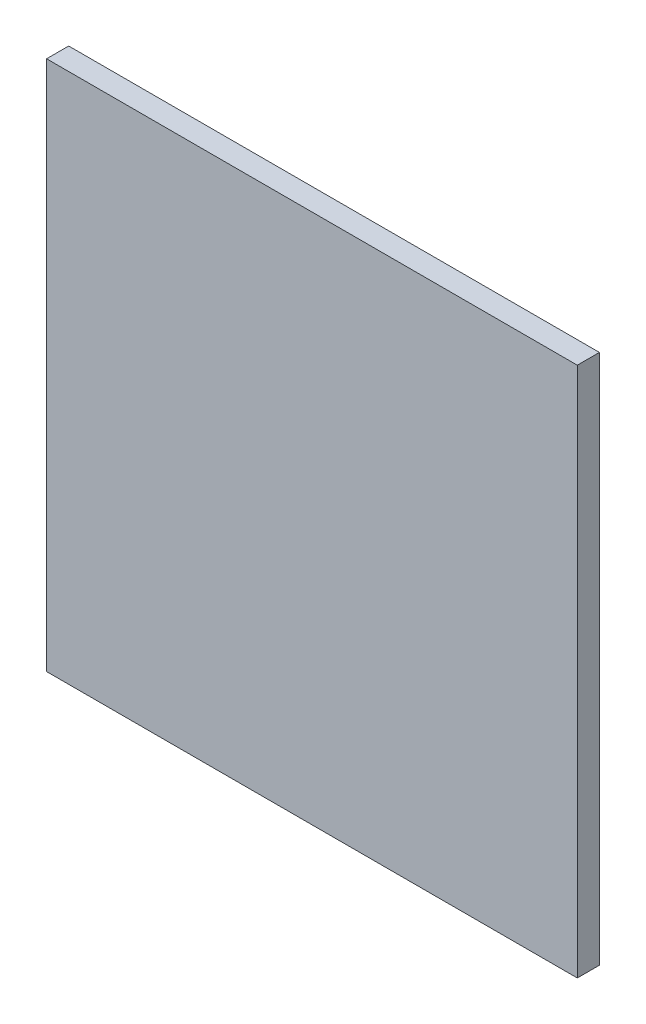
ISO-10303-21;
HEADER;
FILE_DESCRIPTION(('STEP AP214'),'2;1');
FILE_NAME('part.step','',(''),(''),'','','');
FILE_SCHEMA(('AUTOMOTIVE_DESIGN { 1 0 10303 214 1 1 1 1 }'));
ENDSEC;
DATA;
#1=APPLICATION_CONTEXT('core data for automotive mechanical design processes');
#2=APPLICATION_PROTOCOL_DEFINITION('international standard','automotive_design',2000,#1);
#3=PRODUCT_CONTEXT('',#1,'mechanical');
#4=PRODUCT('Part','Part','',(#3));
#5=PRODUCT_RELATED_PRODUCT_CATEGORY('part','',(#4));
#6=PRODUCT_DEFINITION_FORMATION('','',#4);
#7=PRODUCT_DEFINITION_CONTEXT('part definition',#1,'design');
#8=PRODUCT_DEFINITION('design','',#6,#7);
#9=PRODUCT_DEFINITION_SHAPE('','',#8);
#10=(LENGTH_UNIT() NAMED_UNIT(*) SI_UNIT(.MILLI.,.METRE.));
#11=(NAMED_UNIT(*) PLANE_ANGLE_UNIT() SI_UNIT($,.RADIAN.));
#12=(NAMED_UNIT(*) SI_UNIT($,.STERADIAN.) SOLID_ANGLE_UNIT());
#13=UNCERTAINTY_MEASURE_WITH_UNIT(LENGTH_MEASURE(1.E-05),#10,'distance_accuracy_value','');
#14=(GEOMETRIC_REPRESENTATION_CONTEXT(3) GLOBAL_UNCERTAINTY_ASSIGNED_CONTEXT((#13)) GLOBAL_UNIT_ASSIGNED_CONTEXT((#10,
#11,#12)) REPRESENTATION_CONTEXT('',''));
#15=CARTESIAN_POINT('',(0.,0.,0.));
#16=DIRECTION('',(0.,0.,1.));
#17=DIRECTION('',(1.,0.,0.));
#18=AXIS2_PLACEMENT_3D('',#15,#16,#17);
#19=CARTESIAN_POINT('',(60.,60.,5.));
#20=DIRECTION('',(-1.,0.,0.));
#21=DIRECTION('',(0.,-1.,0.));
#22=AXIS2_PLACEMENT_3D('',#19,#20,#21);
#23=PLANE('',#22);
#24=DIRECTION('',(0.,1.,0.));
#25=VECTOR('',#24,1.);
#26=CARTESIAN_POINT('',(60.,60.,0.));
#27=LINE('',#26,#25);
#28=CARTESIAN_POINT('',(60.,-60.,0.));
#29=VERTEX_POINT('',#28);
#30=CARTESIAN_POINT('',(60.,60.,0.));
#31=VERTEX_POINT('',#30);
#32=EDGE_CURVE('E147',#29,#31,#27,.T.);
#33=ORIENTED_EDGE('',*,*,#32,.T.);
#34=DIRECTION('',(0.,0.,-1.));
#35=VECTOR('',#34,1.);
#36=CARTESIAN_POINT('',(60.,60.,5.));
#37=LINE('',#36,#35);
#38=CARTESIAN_POINT('',(60.,60.,5.));
#39=VERTEX_POINT('',#38);
#40=EDGE_CURVE('E11',#39,#31,#37,.T.);
#41=ORIENTED_EDGE('',*,*,#40,.F.);
#42=DIRECTION('',(0.,1.,0.));
#43=VECTOR('',#42,1.);
#44=CARTESIAN_POINT('',(60.,60.,5.));
#45=LINE('',#44,#43);
#46=CARTESIAN_POINT('',(60.,-60.,5.));
#47=VERTEX_POINT('',#46);
#48=EDGE_CURVE('E151',#47,#39,#45,.T.);
#49=ORIENTED_EDGE('',*,*,#48,.F.);
#50=DIRECTION('',(0.,0.,-1.));
#51=VECTOR('',#50,1.);
#52=CARTESIAN_POINT('',(60.,-60.,5.));
#53=LINE('',#52,#51);
#54=EDGE_CURVE('E157',#47,#29,#53,.T.);
#55=ORIENTED_EDGE('',*,*,#54,.T.);
#56=EDGE_LOOP('',(#33,#41,#49,#55));
#57=FACE_BOUND('',#56,.T.);
#58=ADVANCED_FACE('F39',(#57),#23,.F.);
#59=CARTESIAN_POINT('',(-60.,60.,5.));
#60=DIRECTION('',(0.,-1.,0.));
#61=DIRECTION('',(0.,0.,-1.));
#62=AXIS2_PLACEMENT_3D('',#59,#60,#61);
#63=PLANE('',#62);
#64=DIRECTION('',(-1.,0.,0.));
#65=VECTOR('',#64,1.);
#66=CARTESIAN_POINT('',(-60.,60.,0.));
#67=LINE('',#66,#65);
#68=CARTESIAN_POINT('',(-60.,60.,0.));
#69=VERTEX_POINT('',#68);
#70=EDGE_CURVE('E160',#31,#69,#67,.T.);
#71=ORIENTED_EDGE('',*,*,#70,.T.);
#72=DIRECTION('',(0.,0.,-1.));
#73=VECTOR('',#72,1.);
#74=CARTESIAN_POINT('',(-60.,60.,5.));
#75=LINE('',#74,#73);
#76=CARTESIAN_POINT('',(-60.,60.,5.));
#77=VERTEX_POINT('',#76);
#78=EDGE_CURVE('E46',#77,#69,#75,.T.);
#79=ORIENTED_EDGE('',*,*,#78,.F.);
#80=DIRECTION('',(-1.,0.,0.));
#81=VECTOR('',#80,1.);
#82=CARTESIAN_POINT('',(-60.,60.,5.));
#83=LINE('',#82,#81);
#84=EDGE_CURVE('E90',#39,#77,#83,.T.);
#85=ORIENTED_EDGE('',*,*,#84,.F.);
#86=ORIENTED_EDGE('',*,*,#40,.T.);
#87=EDGE_LOOP('',(#71,#79,#85,#86));
#88=FACE_BOUND('',#87,.T.);
#89=ADVANCED_FACE('F188',(#88),#63,.F.);
#90=CARTESIAN_POINT('',(-60.,60.,5.));
#91=DIRECTION('',(1.,0.,0.));
#92=DIRECTION('',(0.,0.,-1.));
#93=AXIS2_PLACEMENT_3D('',#90,#91,#92);
#94=PLANE('',#93);
#95=DIRECTION('',(0.,-1.,0.));
#96=VECTOR('',#95,1.);
#97=CARTESIAN_POINT('',(-60.,60.,0.));
#98=LINE('',#97,#96);
#99=CARTESIAN_POINT('',(-60.,-60.,0.));
#100=VERTEX_POINT('',#99);
#101=EDGE_CURVE('E162',#69,#100,#98,.T.);
#102=ORIENTED_EDGE('',*,*,#101,.T.);
#103=DIRECTION('',(0.,0.,-1.));
#104=VECTOR('',#103,1.);
#105=CARTESIAN_POINT('',(-60.,-60.,5.));
#106=LINE('',#105,#104);
#107=CARTESIAN_POINT('',(-60.,-60.,5.));
#108=VERTEX_POINT('',#107);
#109=EDGE_CURVE('E166',#108,#100,#106,.T.);
#110=ORIENTED_EDGE('',*,*,#109,.F.);
#111=DIRECTION('',(0.,-1.,0.));
#112=VECTOR('',#111,1.);
#113=CARTESIAN_POINT('',(-60.,60.,5.));
#114=LINE('',#113,#112);
#115=EDGE_CURVE('E154',#77,#108,#114,.T.);
#116=ORIENTED_EDGE('',*,*,#115,.F.);
#117=ORIENTED_EDGE('',*,*,#78,.T.);
#118=EDGE_LOOP('',(#102,#110,#116,#117));
#119=FACE_BOUND('',#118,.T.);
#120=ADVANCED_FACE('F171',(#119),#94,.F.);
#121=CARTESIAN_POINT('',(-60.,-60.,5.));
#122=DIRECTION('',(0.,1.,0.));
#123=DIRECTION('',(0.,0.,1.));
#124=AXIS2_PLACEMENT_3D('',#121,#122,#123);
#125=PLANE('',#124);
#126=DIRECTION('',(1.,0.,0.));
#127=VECTOR('',#126,1.);
#128=CARTESIAN_POINT('',(-60.,-60.,0.));
#129=LINE('',#128,#127);
#130=EDGE_CURVE('E83',#100,#29,#129,.T.);
#131=ORIENTED_EDGE('',*,*,#130,.T.);
#132=ORIENTED_EDGE('',*,*,#54,.F.);
#133=DIRECTION('',(1.,0.,0.));
#134=VECTOR('',#133,1.);
#135=CARTESIAN_POINT('',(-60.,-60.,5.));
#136=LINE('',#135,#134);
#137=EDGE_CURVE('E62',#108,#47,#136,.T.);
#138=ORIENTED_EDGE('',*,*,#137,.F.);
#139=ORIENTED_EDGE('',*,*,#109,.T.);
#140=EDGE_LOOP('',(#131,#132,#138,#139));
#141=FACE_BOUND('',#140,.T.);
#142=ADVANCED_FACE('F179',(#141),#125,.F.);
#143=CARTESIAN_POINT('',(0.,0.,5.));
#144=DIRECTION('',(0.,0.,1.));
#145=DIRECTION('',(1.,0.,0.));
#146=AXIS2_PLACEMENT_3D('',#143,#144,#145);
#147=PLANE('',#146);
#148=ORIENTED_EDGE('',*,*,#48,.T.);
#149=ORIENTED_EDGE('',*,*,#84,.T.);
#150=ORIENTED_EDGE('',*,*,#115,.T.);
#151=ORIENTED_EDGE('',*,*,#137,.T.);
#152=EDGE_LOOP('',(#148,#149,#150,#151));
#153=FACE_BOUND('',#152,.T.);
#154=ADVANCED_FACE('F181',(#153),#147,.T.);
#155=CARTESIAN_POINT('',(0.,0.,0.));
#156=DIRECTION('',(0.,0.,1.));
#157=DIRECTION('',(1.,0.,0.));
#158=AXIS2_PLACEMENT_3D('',#155,#156,#157);
#159=PLANE('',#158);
#160=DIRECTION('',(1.,0.,0.));
#161=VECTOR('',#160,1.);
#162=CARTESIAN_POINT('',(50.,50.,0.));
#163=LINE('',#162,#161);
#164=CARTESIAN_POINT('',(-50.,50.,0.));
#165=VERTEX_POINT('',#164);
#166=CARTESIAN_POINT('',(50.,50.,0.));
#167=VERTEX_POINT('',#166);
#168=EDGE_CURVE('E141',#165,#167,#163,.T.);
#169=ORIENTED_EDGE('',*,*,#168,.F.);
#170=DIRECTION('',(0.,1.,0.));
#171=VECTOR('',#170,1.);
#172=CARTESIAN_POINT('',(-50.,50.,0.));
#173=LINE('',#172,#171);
#174=CARTESIAN_POINT('',(-50.,-50.,0.));
#175=VERTEX_POINT('',#174);
#176=EDGE_CURVE('E53',#175,#165,#173,.T.);
#177=ORIENTED_EDGE('',*,*,#176,.F.);
#178=DIRECTION('',(-1.,0.,0.));
#179=VECTOR('',#178,1.);
#180=CARTESIAN_POINT('',(50.,-50.,0.));
#181=LINE('',#180,#179);
#182=CARTESIAN_POINT('',(50.,-50.,0.));
#183=VERTEX_POINT('',#182);
#184=EDGE_CURVE('E132',#183,#175,#181,.T.);
#185=ORIENTED_EDGE('',*,*,#184,.F.);
#186=DIRECTION('',(0.,-1.,0.));
#187=VECTOR('',#186,1.);
#188=CARTESIAN_POINT('',(50.,50.,0.));
#189=LINE('',#188,#187);
#190=EDGE_CURVE('E135',#167,#183,#189,.T.);
#191=ORIENTED_EDGE('',*,*,#190,.F.);
#192=EDGE_LOOP('',(#169,#177,#185,#191));
#193=FACE_BOUND('',#192,.T.);
#194=ORIENTED_EDGE('',*,*,#32,.F.);
#195=ORIENTED_EDGE('',*,*,#130,.F.);
#196=ORIENTED_EDGE('',*,*,#101,.F.);
#197=ORIENTED_EDGE('',*,*,#70,.F.);
#198=EDGE_LOOP('',(#194,#195,#196,#197));
#199=FACE_BOUND('',#198,.T.);
#200=ADVANCED_FACE('F175',(#193,#199),#159,.F.);
#201=CARTESIAN_POINT('',(-50.,50.,1.));
#202=DIRECTION('',(-1.,0.,0.));
#203=DIRECTION('',(0.,-1.,0.));
#204=AXIS2_PLACEMENT_3D('',#201,#202,#203);
#205=PLANE('',#204);
#206=ORIENTED_EDGE('',*,*,#176,.T.);
#207=DIRECTION('',(0.,0.,-1.));
#208=VECTOR('',#207,1.);
#209=CARTESIAN_POINT('',(-50.,50.,1.));
#210=LINE('',#209,#208);
#211=CARTESIAN_POINT('',(-50.,50.,1.));
#212=VERTEX_POINT('',#211);
#213=EDGE_CURVE('E110',#212,#165,#210,.T.);
#214=ORIENTED_EDGE('',*,*,#213,.F.);
#215=DIRECTION('',(0.,1.,0.));
#216=VECTOR('',#215,1.);
#217=CARTESIAN_POINT('',(-50.,50.,1.));
#218=LINE('',#217,#216);
#219=CARTESIAN_POINT('',(-50.,-50.,1.));
#220=VERTEX_POINT('',#219);
#221=EDGE_CURVE('E114',#220,#212,#218,.T.);
#222=ORIENTED_EDGE('',*,*,#221,.F.);
#223=DIRECTION('',(0.,0.,-1.));
#224=VECTOR('',#223,1.);
#225=CARTESIAN_POINT('',(-50.,-50.,1.));
#226=LINE('',#225,#224);
#227=EDGE_CURVE('E145',#220,#175,#226,.T.);
#228=ORIENTED_EDGE('',*,*,#227,.T.);
#229=EDGE_LOOP('',(#206,#214,#222,#228));
#230=FACE_BOUND('',#229,.T.);
#231=ADVANCED_FACE('F112',(#230),#205,.F.);
#232=CARTESIAN_POINT('',(50.,-50.,1.));
#233=DIRECTION('',(0.,-1.,0.));
#234=DIRECTION('',(0.,0.,-1.));
#235=AXIS2_PLACEMENT_3D('',#232,#233,#234);
#236=PLANE('',#235);
#237=ORIENTED_EDGE('',*,*,#184,.T.);
#238=ORIENTED_EDGE('',*,*,#227,.F.);
#239=DIRECTION('',(-1.,0.,0.));
#240=VECTOR('',#239,1.);
#241=CARTESIAN_POINT('',(50.,-50.,1.));
#242=LINE('',#241,#240);
#243=CARTESIAN_POINT('',(50.,-50.,1.));
#244=VERTEX_POINT('',#243);
#245=EDGE_CURVE('E120',#244,#220,#242,.T.);
#246=ORIENTED_EDGE('',*,*,#245,.F.);
#247=DIRECTION('',(0.,0.,-1.));
#248=VECTOR('',#247,1.);
#249=CARTESIAN_POINT('',(50.,-50.,1.));
#250=LINE('',#249,#248);
#251=EDGE_CURVE('E148',#244,#183,#250,.T.);
#252=ORIENTED_EDGE('',*,*,#251,.T.);
#253=EDGE_LOOP('',(#237,#238,#246,#252));
#254=FACE_BOUND('',#253,.T.);
#255=ADVANCED_FACE('F220',(#254),#236,.F.);
#256=CARTESIAN_POINT('',(50.,50.,1.));
#257=DIRECTION('',(1.,0.,0.));
#258=DIRECTION('',(0.,1.,0.));
#259=AXIS2_PLACEMENT_3D('',#256,#257,#258);
#260=PLANE('',#259);
#261=ORIENTED_EDGE('',*,*,#190,.T.);
#262=ORIENTED_EDGE('',*,*,#251,.F.);
#263=DIRECTION('',(0.,-1.,0.));
#264=VECTOR('',#263,1.);
#265=CARTESIAN_POINT('',(50.,50.,1.));
#266=LINE('',#265,#264);
#267=CARTESIAN_POINT('',(50.,50.,1.));
#268=VERTEX_POINT('',#267);
#269=EDGE_CURVE('E128',#268,#244,#266,.T.);
#270=ORIENTED_EDGE('',*,*,#269,.F.);
#271=DIRECTION('',(0.,0.,-1.));
#272=VECTOR('',#271,1.);
#273=CARTESIAN_POINT('',(50.,50.,1.));
#274=LINE('',#273,#272);
#275=EDGE_CURVE('E119',#268,#167,#274,.T.);
#276=ORIENTED_EDGE('',*,*,#275,.T.);
#277=EDGE_LOOP('',(#261,#262,#270,#276));
#278=FACE_BOUND('',#277,.T.);
#279=ADVANCED_FACE('F227',(#278),#260,.F.);
#280=CARTESIAN_POINT('',(50.,50.,1.));
#281=DIRECTION('',(0.,1.,0.));
#282=DIRECTION('',(0.,0.,1.));
#283=AXIS2_PLACEMENT_3D('',#280,#281,#282);
#284=PLANE('',#283);
#285=ORIENTED_EDGE('',*,*,#168,.T.);
#286=ORIENTED_EDGE('',*,*,#275,.F.);
#287=DIRECTION('',(1.,0.,0.));
#288=VECTOR('',#287,1.);
#289=CARTESIAN_POINT('',(50.,50.,1.));
#290=LINE('',#289,#288);
#291=EDGE_CURVE('E123',#212,#268,#290,.T.);
#292=ORIENTED_EDGE('',*,*,#291,.F.);
#293=ORIENTED_EDGE('',*,*,#213,.T.);
#294=EDGE_LOOP('',(#285,#286,#292,#293));
#295=FACE_BOUND('',#294,.T.);
#296=ADVANCED_FACE('F124',(#295),#284,.F.);
#297=CARTESIAN_POINT('',(0.,0.,1.));
#298=DIRECTION('',(0.,0.,-1.));
#299=DIRECTION('',(-1.,0.,0.));
#300=AXIS2_PLACEMENT_3D('',#297,#298,#299);
#301=PLANE('',#300);
#302=ORIENTED_EDGE('',*,*,#221,.T.);
#303=ORIENTED_EDGE('',*,*,#291,.T.);
#304=ORIENTED_EDGE('',*,*,#269,.T.);
#305=ORIENTED_EDGE('',*,*,#245,.T.);
#306=EDGE_LOOP('',(#302,#303,#304,#305));
#307=FACE_BOUND('',#306,.T.);
#308=ADVANCED_FACE('F130',(#307),#301,.T.);
#309=CLOSED_SHELL('',(#58,#89,#120,#142,#154,#200,#231,#255,#279,#296,#308));
#310=MANIFOLD_SOLID_BREP('B2',#309);
#311=ADVANCED_BREP_SHAPE_REPRESENTATION('',(#18,#310),#14);
#312=SHAPE_DEFINITION_REPRESENTATION(#9,#311);
ENDSEC;
END-ISO-10303-21;
